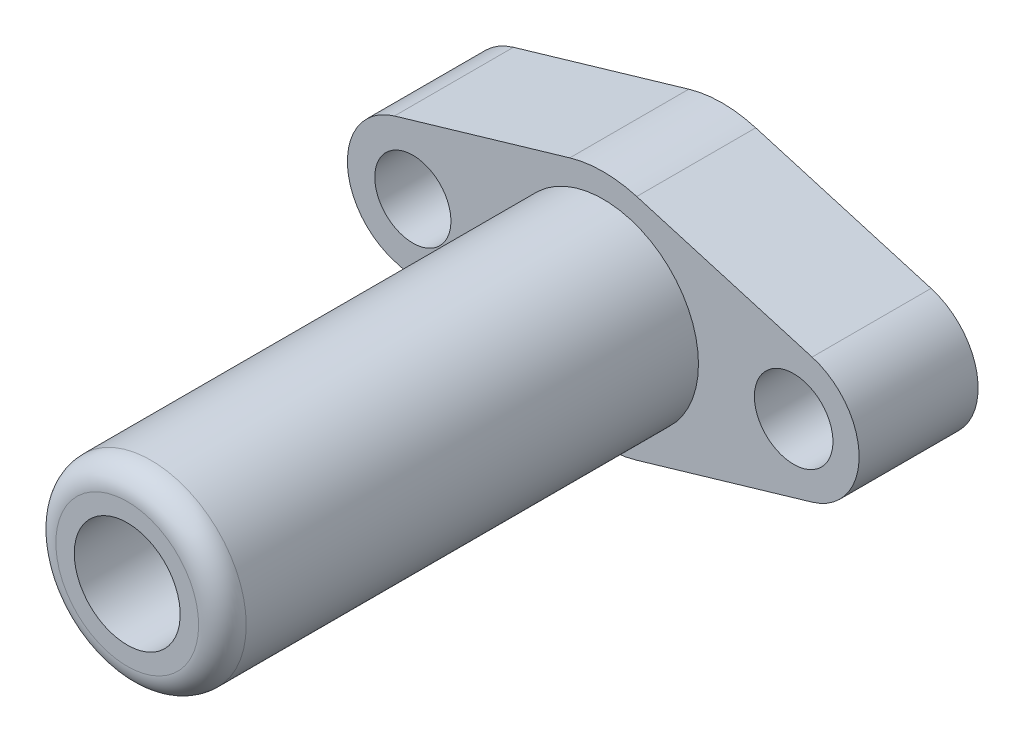
ISO-10303-21;
HEADER;
FILE_DESCRIPTION(('STEP AP214'),'2;1');
FILE_NAME('part.step','',(''),(''),'','','');
FILE_SCHEMA(('AUTOMOTIVE_DESIGN { 1 0 10303 214 1 1 1 1 }'));
ENDSEC;
DATA;
#1=APPLICATION_CONTEXT('core data for automotive mechanical design processes');
#2=APPLICATION_PROTOCOL_DEFINITION('international standard','automotive_design',2000,#1);
#3=PRODUCT_CONTEXT('',#1,'mechanical');
#4=PRODUCT('Part','Part','',(#3));
#5=PRODUCT_RELATED_PRODUCT_CATEGORY('part','',(#4));
#6=PRODUCT_DEFINITION_FORMATION('','',#4);
#7=PRODUCT_DEFINITION_CONTEXT('part definition',#1,'design');
#8=PRODUCT_DEFINITION('design','',#6,#7);
#9=PRODUCT_DEFINITION_SHAPE('','',#8);
#10=(LENGTH_UNIT() NAMED_UNIT(*) SI_UNIT(.MILLI.,.METRE.));
#11=(NAMED_UNIT(*) PLANE_ANGLE_UNIT() SI_UNIT($,.RADIAN.));
#12=(NAMED_UNIT(*) SI_UNIT($,.STERADIAN.) SOLID_ANGLE_UNIT());
#13=UNCERTAINTY_MEASURE_WITH_UNIT(LENGTH_MEASURE(1.E-05),#10,'distance_accuracy_value','');
#14=(GEOMETRIC_REPRESENTATION_CONTEXT(3) GLOBAL_UNCERTAINTY_ASSIGNED_CONTEXT((#13)) GLOBAL_UNIT_ASSIGNED_CONTEXT((#10,
#11,#12)) REPRESENTATION_CONTEXT('',''));
#15=CARTESIAN_POINT('',(0.,0.,0.));
#16=DIRECTION('',(0.,0.,1.));
#17=DIRECTION('',(1.,0.,0.));
#18=AXIS2_PLACEMENT_3D('',#15,#16,#17);
#19=CARTESIAN_POINT('',(0.,0.,20.));
#20=DIRECTION('',(0.,0.,-1.));
#21=DIRECTION('',(-1.,0.,0.));
#22=AXIS2_PLACEMENT_3D('',#19,#20,#21);
#23=CYLINDRICAL_SURFACE('',#22,4.);
#24=CARTESIAN_POINT('',(0.,0.,19.));
#25=DIRECTION('',(0.,0.,1.));
#26=DIRECTION('',(1.,0.,0.));
#27=AXIS2_PLACEMENT_3D('',#24,#25,#26);
#28=CIRCLE('',#27,4.);
#29=CARTESIAN_POINT('',(4.,0.,19.));
#30=VERTEX_POINT('',#29);
#31=EDGE_CURVE('E11',#30,#30,#28,.F.);
#32=ORIENTED_EDGE('',*,*,#31,.T.);
#33=EDGE_LOOP('',(#32));
#34=FACE_BOUND('',#33,.T.);
#35=CARTESIAN_POINT('',(0.,0.,0.));
#36=DIRECTION('',(0.,0.,1.));
#37=DIRECTION('',(1.,0.,0.));
#38=AXIS2_PLACEMENT_3D('',#35,#36,#37);
#39=CIRCLE('',#38,4.);
#40=CARTESIAN_POINT('',(4.,0.,0.));
#41=VERTEX_POINT('',#40);
#42=EDGE_CURVE('E194',#41,#41,#39,.T.);
#43=ORIENTED_EDGE('',*,*,#42,.T.);
#44=EDGE_LOOP('',(#43));
#45=FACE_BOUND('',#44,.T.);
#46=ADVANCED_FACE('F45',(#34,#45),#23,.T.);
#47=CARTESIAN_POINT('',(0.,0.,20.));
#48=DIRECTION('',(0.,0.,1.));
#49=DIRECTION('',(1.,0.,0.));
#50=AXIS2_PLACEMENT_3D('',#47,#48,#49);
#51=PLANE('',#50);
#52=CARTESIAN_POINT('',(0.,0.,20.));
#53=DIRECTION('',(0.,0.,1.));
#54=DIRECTION('',(1.,0.,0.));
#55=AXIS2_PLACEMENT_3D('',#52,#53,#54);
#56=CIRCLE('',#55,3.);
#57=CARTESIAN_POINT('',(3.,0.,20.));
#58=VERTEX_POINT('',#57);
#59=EDGE_CURVE('E55',#58,#58,#56,.T.);
#60=ORIENTED_EDGE('',*,*,#59,.T.);
#61=EDGE_LOOP('',(#60));
#62=FACE_BOUND('',#61,.T.);
#63=CARTESIAN_POINT('',(0.,0.,20.));
#64=DIRECTION('',(0.,0.,-1.));
#65=DIRECTION('',(-1.,0.,0.));
#66=AXIS2_PLACEMENT_3D('',#63,#64,#65);
#67=CIRCLE('',#66,2.225);
#68=CARTESIAN_POINT('',(-2.225,0.,20.));
#69=VERTEX_POINT('',#68);
#70=EDGE_CURVE('E288',#69,#69,#67,.T.);
#71=ORIENTED_EDGE('',*,*,#70,.T.);
#72=EDGE_LOOP('',(#71));
#73=FACE_BOUND('',#72,.T.);
#74=ADVANCED_FACE('F201',(#62,#73),#51,.T.);
#75=CARTESIAN_POINT('',(0.,0.,-5.));
#76=DIRECTION('',(0.,0.,-1.));
#77=DIRECTION('',(-1.,0.,0.));
#78=AXIS2_PLACEMENT_3D('',#75,#76,#77);
#79=PLANE('',#78);
#80=CARTESIAN_POINT('',(0.,0.,-5.));
#81=DIRECTION('',(0.,0.,-1.));
#82=DIRECTION('',(-1.,0.,0.));
#83=AXIS2_PLACEMENT_3D('',#80,#81,#82);
#84=CIRCLE('',#83,2.25);
#85=CARTESIAN_POINT('',(-2.25,0.,-5.));
#86=VERTEX_POINT('',#85);
#87=EDGE_CURVE('E280',#86,#86,#84,.T.);
#88=ORIENTED_EDGE('',*,*,#87,.F.);
#89=EDGE_LOOP('',(#88));
#90=FACE_BOUND('',#89,.T.);
#91=CARTESIAN_POINT('',(8.,0.,-5.));
#92=DIRECTION('',(0.,0.,-1.));
#93=DIRECTION('',(-1.,0.,0.));
#94=AXIS2_PLACEMENT_3D('',#91,#92,#93);
#95=CIRCLE('',#94,1.65);
#96=CARTESIAN_POINT('',(6.35,0.,-5.));
#97=VERTEX_POINT('',#96);
#98=EDGE_CURVE('E154',#97,#97,#95,.T.);
#99=ORIENTED_EDGE('',*,*,#98,.F.);
#100=EDGE_LOOP('',(#99));
#101=FACE_BOUND('',#100,.T.);
#102=CARTESIAN_POINT('',(0.,0.,-5.));
#103=DIRECTION('',(0.,0.,-1.));
#104=DIRECTION('',(-1.,0.,0.));
#105=AXIS2_PLACEMENT_3D('',#102,#103,#104);
#106=CIRCLE('',#105,5.);
#107=CARTESIAN_POINT('',(-1.40625,4.79817266649503,-5.));
#108=VERTEX_POINT('',#107);
#109=CARTESIAN_POINT('',(1.40625,4.79817266649503,-5.));
#110=VERTEX_POINT('',#109);
#111=EDGE_CURVE('E172',#108,#110,#106,.T.);
#112=ORIENTED_EDGE('',*,*,#111,.T.);
#113=DIRECTION('',(0.959634533299005,-0.28125,0.));
#114=VECTOR('',#113,1.);
#115=CARTESIAN_POINT('',(8.7734375,2.63899496657226,-5.));
#116=LINE('',#115,#114);
#117=CARTESIAN_POINT('',(8.7734375,2.63899496657226,-5.));
#118=VERTEX_POINT('',#117);
#119=EDGE_CURVE('E107',#110,#118,#116,.T.);
#120=ORIENTED_EDGE('',*,*,#119,.T.);
#121=CARTESIAN_POINT('',(8.,0.,-5.));
#122=DIRECTION('',(0.,0.,-1.));
#123=DIRECTION('',(-1.,0.,0.));
#124=AXIS2_PLACEMENT_3D('',#121,#122,#123);
#125=CIRCLE('',#124,2.75);
#126=CARTESIAN_POINT('',(8.7734375,-2.63899496657226,-5.));
#127=VERTEX_POINT('',#126);
#128=EDGE_CURVE('E307',#118,#127,#125,.T.);
#129=ORIENTED_EDGE('',*,*,#128,.T.);
#130=DIRECTION('',(-0.959634533299005,-0.28125,0.));
#131=VECTOR('',#130,1.);
#132=CARTESIAN_POINT('',(8.7734375,-2.63899496657226,-5.));
#133=LINE('',#132,#131);
#134=CARTESIAN_POINT('',(1.40625,-4.79817266649503,-5.));
#135=VERTEX_POINT('',#134);
#136=EDGE_CURVE('E310',#127,#135,#133,.T.);
#137=ORIENTED_EDGE('',*,*,#136,.T.);
#138=CARTESIAN_POINT('',(0.,0.,-5.));
#139=DIRECTION('',(0.,0.,-1.));
#140=DIRECTION('',(-1.,0.,0.));
#141=AXIS2_PLACEMENT_3D('',#138,#139,#140);
#142=CIRCLE('',#141,5.);
#143=CARTESIAN_POINT('',(-1.40625,-4.79817266649503,-5.));
#144=VERTEX_POINT('',#143);
#145=EDGE_CURVE('E127',#135,#144,#142,.T.);
#146=ORIENTED_EDGE('',*,*,#145,.T.);
#147=DIRECTION('',(-0.959634533299005,0.28125,0.));
#148=VECTOR('',#147,1.);
#149=CARTESIAN_POINT('',(-8.7734375,-2.63899496657226,-5.));
#150=LINE('',#149,#148);
#151=CARTESIAN_POINT('',(-8.7734375,-2.63899496657226,-5.));
#152=VERTEX_POINT('',#151);
#153=EDGE_CURVE('E120',#144,#152,#150,.T.);
#154=ORIENTED_EDGE('',*,*,#153,.T.);
#155=CARTESIAN_POINT('',(-8.,0.,-5.));
#156=DIRECTION('',(0.,0.,-1.));
#157=DIRECTION('',(-1.,0.,0.));
#158=AXIS2_PLACEMENT_3D('',#155,#156,#157);
#159=CIRCLE('',#158,2.75);
#160=CARTESIAN_POINT('',(-8.7734375,2.63899496657227,-5.));
#161=VERTEX_POINT('',#160);
#162=EDGE_CURVE('E125',#152,#161,#159,.T.);
#163=ORIENTED_EDGE('',*,*,#162,.T.);
#164=DIRECTION('',(0.959634533299005,0.28125,0.));
#165=VECTOR('',#164,1.);
#166=CARTESIAN_POINT('',(-8.7734375,2.63899496657226,-5.));
#167=LINE('',#166,#165);
#168=EDGE_CURVE('E63',#161,#108,#167,.T.);
#169=ORIENTED_EDGE('',*,*,#168,.T.);
#170=EDGE_LOOP('',(#112,#120,#129,#137,#146,#154,#163,#169));
#171=FACE_BOUND('',#170,.T.);
#172=CARTESIAN_POINT('',(-8.,0.,-5.));
#173=DIRECTION('',(0.,0.,-1.));
#174=DIRECTION('',(-1.,0.,0.));
#175=AXIS2_PLACEMENT_3D('',#172,#173,#174);
#176=CIRCLE('',#175,1.6);
#177=CARTESIAN_POINT('',(-9.6,0.,-5.));
#178=VERTEX_POINT('',#177);
#179=EDGE_CURVE('E285',#178,#178,#176,.T.);
#180=ORIENTED_EDGE('',*,*,#179,.F.);
#181=EDGE_LOOP('',(#180));
#182=FACE_BOUND('',#181,.T.);
#183=ADVANCED_FACE('F122',(#90,#101,#171,#182),#79,.T.);
#184=CARTESIAN_POINT('',(0.,0.,0.));
#185=DIRECTION('',(0.,0.,-1.));
#186=DIRECTION('',(-1.,0.,0.));
#187=AXIS2_PLACEMENT_3D('',#184,#185,#186);
#188=PLANE('',#187);
#189=ORIENTED_EDGE('',*,*,#42,.F.);
#190=EDGE_LOOP('',(#189));
#191=FACE_BOUND('',#190,.T.);
#192=CARTESIAN_POINT('',(0.,0.,0.));
#193=DIRECTION('',(0.,0.,-1.));
#194=DIRECTION('',(-1.,0.,0.));
#195=AXIS2_PLACEMENT_3D('',#192,#193,#194);
#196=CIRCLE('',#195,5.);
#197=CARTESIAN_POINT('',(-1.40625,4.79817266649503,0.));
#198=VERTEX_POINT('',#197);
#199=CARTESIAN_POINT('',(1.40625,4.79817266649503,0.));
#200=VERTEX_POINT('',#199);
#201=EDGE_CURVE('E149',#198,#200,#196,.T.);
#202=ORIENTED_EDGE('',*,*,#201,.F.);
#203=DIRECTION('',(0.959634533299005,0.28125,0.));
#204=VECTOR('',#203,1.);
#205=CARTESIAN_POINT('',(-8.7734375,2.63899496657226,0.));
#206=LINE('',#205,#204);
#207=CARTESIAN_POINT('',(-8.7734375,2.63899496657227,0.));
#208=VERTEX_POINT('',#207);
#209=EDGE_CURVE('E98',#208,#198,#206,.T.);
#210=ORIENTED_EDGE('',*,*,#209,.F.);
#211=CARTESIAN_POINT('',(-8.,0.,0.));
#212=DIRECTION('',(0.,0.,-1.));
#213=DIRECTION('',(-1.,0.,0.));
#214=AXIS2_PLACEMENT_3D('',#211,#212,#213);
#215=CIRCLE('',#214,2.75);
#216=CARTESIAN_POINT('',(-8.7734375,-2.63899496657226,0.));
#217=VERTEX_POINT('',#216);
#218=EDGE_CURVE('E92',#217,#208,#215,.T.);
#219=ORIENTED_EDGE('',*,*,#218,.F.);
#220=DIRECTION('',(-0.959634533299005,0.28125,0.));
#221=VECTOR('',#220,1.);
#222=CARTESIAN_POINT('',(-8.7734375,-2.63899496657226,0.));
#223=LINE('',#222,#221);
#224=CARTESIAN_POINT('',(-1.40625,-4.79817266649503,0.));
#225=VERTEX_POINT('',#224);
#226=EDGE_CURVE('E136',#225,#217,#223,.T.);
#227=ORIENTED_EDGE('',*,*,#226,.F.);
#228=CARTESIAN_POINT('',(0.,0.,0.));
#229=DIRECTION('',(0.,0.,-1.));
#230=DIRECTION('',(-1.,0.,0.));
#231=AXIS2_PLACEMENT_3D('',#228,#229,#230);
#232=CIRCLE('',#231,5.);
#233=CARTESIAN_POINT('',(1.40625,-4.79817266649503,0.));
#234=VERTEX_POINT('',#233);
#235=EDGE_CURVE('E163',#234,#225,#232,.T.);
#236=ORIENTED_EDGE('',*,*,#235,.F.);
#237=DIRECTION('',(-0.959634533299005,-0.28125,0.));
#238=VECTOR('',#237,1.);
#239=CARTESIAN_POINT('',(8.7734375,-2.63899496657226,0.));
#240=LINE('',#239,#238);
#241=CARTESIAN_POINT('',(8.7734375,-2.63899496657226,0.));
#242=VERTEX_POINT('',#241);
#243=EDGE_CURVE('E160',#242,#234,#240,.T.);
#244=ORIENTED_EDGE('',*,*,#243,.F.);
#245=CARTESIAN_POINT('',(8.,0.,0.));
#246=DIRECTION('',(0.,0.,-1.));
#247=DIRECTION('',(-1.,0.,0.));
#248=AXIS2_PLACEMENT_3D('',#245,#246,#247);
#249=CIRCLE('',#248,2.75);
#250=CARTESIAN_POINT('',(8.7734375,2.63899496657226,0.));
#251=VERTEX_POINT('',#250);
#252=EDGE_CURVE('E157',#251,#242,#249,.T.);
#253=ORIENTED_EDGE('',*,*,#252,.F.);
#254=DIRECTION('',(0.959634533299005,-0.28125,0.));
#255=VECTOR('',#254,1.);
#256=CARTESIAN_POINT('',(8.7734375,2.63899496657226,0.));
#257=LINE('',#256,#255);
#258=EDGE_CURVE('E153',#200,#251,#257,.T.);
#259=ORIENTED_EDGE('',*,*,#258,.F.);
#260=EDGE_LOOP('',(#202,#210,#219,#227,#236,#244,#253,#259));
#261=FACE_BOUND('',#260,.T.);
#262=CARTESIAN_POINT('',(8.,0.,0.));
#263=DIRECTION('',(0.,0.,-1.));
#264=DIRECTION('',(-1.,0.,0.));
#265=AXIS2_PLACEMENT_3D('',#262,#263,#264);
#266=CIRCLE('',#265,1.65);
#267=CARTESIAN_POINT('',(6.35,0.,0.));
#268=VERTEX_POINT('',#267);
#269=EDGE_CURVE('E295',#268,#268,#266,.T.);
#270=ORIENTED_EDGE('',*,*,#269,.T.);
#271=EDGE_LOOP('',(#270));
#272=FACE_BOUND('',#271,.T.);
#273=CARTESIAN_POINT('',(-8.,0.,0.));
#274=DIRECTION('',(0.,0.,-1.));
#275=DIRECTION('',(-1.,0.,0.));
#276=AXIS2_PLACEMENT_3D('',#273,#274,#275);
#277=CIRCLE('',#276,1.6);
#278=CARTESIAN_POINT('',(-9.6,0.,0.));
#279=VERTEX_POINT('',#278);
#280=EDGE_CURVE('E279',#279,#279,#277,.T.);
#281=ORIENTED_EDGE('',*,*,#280,.T.);
#282=EDGE_LOOP('',(#281));
#283=FACE_BOUND('',#282,.T.);
#284=ADVANCED_FACE('F226',(#191,#261,#272,#283),#188,.F.);
#285=CARTESIAN_POINT('',(0.,0.,-5.));
#286=DIRECTION('',(0.,0.,1.));
#287=DIRECTION('',(1.,0.,0.));
#288=AXIS2_PLACEMENT_3D('',#285,#286,#287);
#289=CYLINDRICAL_SURFACE('',#288,5.);
#290=ORIENTED_EDGE('',*,*,#201,.T.);
#291=DIRECTION('',(0.,0.,1.));
#292=VECTOR('',#291,1.);
#293=CARTESIAN_POINT('',(1.40625,4.79817266649503,-5.));
#294=LINE('',#293,#292);
#295=EDGE_CURVE('E191',#110,#200,#294,.T.);
#296=ORIENTED_EDGE('',*,*,#295,.F.);
#297=ORIENTED_EDGE('',*,*,#111,.F.);
#298=DIRECTION('',(0.,0.,1.));
#299=VECTOR('',#298,1.);
#300=CARTESIAN_POINT('',(-1.40625,4.79817266649503,-5.));
#301=LINE('',#300,#299);
#302=EDGE_CURVE('E145',#108,#198,#301,.T.);
#303=ORIENTED_EDGE('',*,*,#302,.T.);
#304=EDGE_LOOP('',(#290,#296,#297,#303));
#305=FACE_BOUND('',#304,.T.);
#306=ADVANCED_FACE('F222',(#305),#289,.T.);
#307=CARTESIAN_POINT('',(8.7734375,2.63899496657226,-5.));
#308=DIRECTION('',(-0.28125,-0.959634533299005,0.));
#309=DIRECTION('',(0.959634533299005,-0.28125,0.));
#310=AXIS2_PLACEMENT_3D('',#307,#308,#309);
#311=PLANE('',#310);
#312=ORIENTED_EDGE('',*,*,#258,.T.);
#313=DIRECTION('',(0.,0.,1.));
#314=VECTOR('',#313,1.);
#315=CARTESIAN_POINT('',(8.7734375,2.63899496657226,-5.));
#316=LINE('',#315,#314);
#317=EDGE_CURVE('E187',#118,#251,#316,.T.);
#318=ORIENTED_EDGE('',*,*,#317,.F.);
#319=ORIENTED_EDGE('',*,*,#119,.F.);
#320=ORIENTED_EDGE('',*,*,#295,.T.);
#321=EDGE_LOOP('',(#312,#318,#319,#320));
#322=FACE_BOUND('',#321,.T.);
#323=ADVANCED_FACE('F225',(#322),#311,.F.);
#324=CARTESIAN_POINT('',(8.,0.,-5.));
#325=DIRECTION('',(0.,0.,1.));
#326=DIRECTION('',(1.,0.,0.));
#327=AXIS2_PLACEMENT_3D('',#324,#325,#326);
#328=CYLINDRICAL_SURFACE('',#327,2.75);
#329=ORIENTED_EDGE('',*,*,#252,.T.);
#330=DIRECTION('',(0.,0.,1.));
#331=VECTOR('',#330,1.);
#332=CARTESIAN_POINT('',(8.7734375,-2.63899496657226,-5.));
#333=LINE('',#332,#331);
#334=EDGE_CURVE('E183',#127,#242,#333,.T.);
#335=ORIENTED_EDGE('',*,*,#334,.F.);
#336=ORIENTED_EDGE('',*,*,#128,.F.);
#337=ORIENTED_EDGE('',*,*,#317,.T.);
#338=EDGE_LOOP('',(#329,#335,#336,#337));
#339=FACE_BOUND('',#338,.T.);
#340=ADVANCED_FACE('F230',(#339),#328,.T.);
#341=CARTESIAN_POINT('',(8.7734375,-2.63899496657226,-5.));
#342=DIRECTION('',(-0.28125,0.959634533299005,0.));
#343=DIRECTION('',(-0.959634533299005,-0.28125,0.));
#344=AXIS2_PLACEMENT_3D('',#341,#342,#343);
#345=PLANE('',#344);
#346=ORIENTED_EDGE('',*,*,#243,.T.);
#347=DIRECTION('',(0.,0.,1.));
#348=VECTOR('',#347,1.);
#349=CARTESIAN_POINT('',(1.40625,-4.79817266649503,-5.));
#350=LINE('',#349,#348);
#351=EDGE_CURVE('E179',#135,#234,#350,.T.);
#352=ORIENTED_EDGE('',*,*,#351,.F.);
#353=ORIENTED_EDGE('',*,*,#136,.F.);
#354=ORIENTED_EDGE('',*,*,#334,.T.);
#355=EDGE_LOOP('',(#346,#352,#353,#354));
#356=FACE_BOUND('',#355,.T.);
#357=ADVANCED_FACE('F233',(#356),#345,.F.);
#358=CARTESIAN_POINT('',(0.,0.,-5.));
#359=DIRECTION('',(0.,0.,1.));
#360=DIRECTION('',(1.,0.,0.));
#361=AXIS2_PLACEMENT_3D('',#358,#359,#360);
#362=CYLINDRICAL_SURFACE('',#361,5.);
#363=ORIENTED_EDGE('',*,*,#235,.T.);
#364=DIRECTION('',(0.,0.,1.));
#365=VECTOR('',#364,1.);
#366=CARTESIAN_POINT('',(-1.40625,-4.79817266649503,-5.));
#367=LINE('',#366,#365);
#368=EDGE_CURVE('E138',#144,#225,#367,.T.);
#369=ORIENTED_EDGE('',*,*,#368,.F.);
#370=ORIENTED_EDGE('',*,*,#145,.F.);
#371=ORIENTED_EDGE('',*,*,#351,.T.);
#372=EDGE_LOOP('',(#363,#369,#370,#371));
#373=FACE_BOUND('',#372,.T.);
#374=ADVANCED_FACE('F237',(#373),#362,.T.);
#375=CARTESIAN_POINT('',(-8.7734375,-2.63899496657226,-5.));
#376=DIRECTION('',(0.28125,0.959634533299005,0.));
#377=DIRECTION('',(-0.959634533299005,0.28125,0.));
#378=AXIS2_PLACEMENT_3D('',#375,#376,#377);
#379=PLANE('',#378);
#380=ORIENTED_EDGE('',*,*,#226,.T.);
#381=DIRECTION('',(0.,0.,1.));
#382=VECTOR('',#381,1.);
#383=CARTESIAN_POINT('',(-8.7734375,-2.63899496657226,-5.));
#384=LINE('',#383,#382);
#385=EDGE_CURVE('E133',#152,#217,#384,.T.);
#386=ORIENTED_EDGE('',*,*,#385,.F.);
#387=ORIENTED_EDGE('',*,*,#153,.F.);
#388=ORIENTED_EDGE('',*,*,#368,.T.);
#389=EDGE_LOOP('',(#380,#386,#387,#388));
#390=FACE_BOUND('',#389,.T.);
#391=ADVANCED_FACE('F134',(#390),#379,.F.);
#392=CARTESIAN_POINT('',(-8.,0.,-5.));
#393=DIRECTION('',(0.,0.,1.));
#394=DIRECTION('',(1.,0.,0.));
#395=AXIS2_PLACEMENT_3D('',#392,#393,#394);
#396=CYLINDRICAL_SURFACE('',#395,2.75);
#397=ORIENTED_EDGE('',*,*,#218,.T.);
#398=DIRECTION('',(0.,0.,1.));
#399=VECTOR('',#398,1.);
#400=CARTESIAN_POINT('',(-8.7734375,2.63899496657227,-5.));
#401=LINE('',#400,#399);
#402=EDGE_CURVE('E139',#161,#208,#401,.T.);
#403=ORIENTED_EDGE('',*,*,#402,.F.);
#404=ORIENTED_EDGE('',*,*,#162,.F.);
#405=ORIENTED_EDGE('',*,*,#385,.T.);
#406=EDGE_LOOP('',(#397,#403,#404,#405));
#407=FACE_BOUND('',#406,.T.);
#408=ADVANCED_FACE('F141',(#407),#396,.T.);
#409=CARTESIAN_POINT('',(-8.7734375,2.63899496657226,-5.));
#410=DIRECTION('',(0.28125,-0.959634533299005,0.));
#411=DIRECTION('',(0.959634533299005,0.28125,0.));
#412=AXIS2_PLACEMENT_3D('',#409,#410,#411);
#413=PLANE('',#412);
#414=ORIENTED_EDGE('',*,*,#209,.T.);
#415=ORIENTED_EDGE('',*,*,#302,.F.);
#416=ORIENTED_EDGE('',*,*,#168,.F.);
#417=ORIENTED_EDGE('',*,*,#402,.T.);
#418=EDGE_LOOP('',(#414,#415,#416,#417));
#419=FACE_BOUND('',#418,.T.);
#420=ADVANCED_FACE('F246',(#419),#413,.F.);
#421=CARTESIAN_POINT('',(8.,0.,-5.));
#422=DIRECTION('',(0.,0.,1.));
#423=DIRECTION('',(1.,0.,0.));
#424=AXIS2_PLACEMENT_3D('',#421,#422,#423);
#425=CYLINDRICAL_SURFACE('',#424,1.65);
#426=ORIENTED_EDGE('',*,*,#98,.T.);
#427=EDGE_LOOP('',(#426));
#428=FACE_BOUND('',#427,.T.);
#429=ORIENTED_EDGE('',*,*,#269,.F.);
#430=EDGE_LOOP('',(#429));
#431=FACE_BOUND('',#430,.T.);
#432=ADVANCED_FACE('F249',(#428,#431),#425,.F.);
#433=CARTESIAN_POINT('',(-8.,0.,-5.));
#434=DIRECTION('',(0.,0.,1.));
#435=DIRECTION('',(1.,0.,0.));
#436=AXIS2_PLACEMENT_3D('',#433,#434,#435);
#437=CYLINDRICAL_SURFACE('',#436,1.6);
#438=ORIENTED_EDGE('',*,*,#179,.T.);
#439=EDGE_LOOP('',(#438));
#440=FACE_BOUND('',#439,.T.);
#441=ORIENTED_EDGE('',*,*,#280,.F.);
#442=EDGE_LOOP('',(#441));
#443=FACE_BOUND('',#442,.T.);
#444=ADVANCED_FACE('F258',(#440,#443),#437,.F.);
#445=CARTESIAN_POINT('',(0.,0.,7.));
#446=DIRECTION('',(0.,0.,-1.));
#447=DIRECTION('',(-1.,0.,0.));
#448=AXIS2_PLACEMENT_3D('',#445,#446,#447);
#449=CYLINDRICAL_SURFACE('',#448,2.25);
#450=CARTESIAN_POINT('',(0.,0.,7.));
#451=DIRECTION('',(0.,0.,-1.));
#452=DIRECTION('',(-1.,0.,0.));
#453=AXIS2_PLACEMENT_3D('',#450,#451,#452);
#454=CIRCLE('',#453,2.25);
#455=CARTESIAN_POINT('',(-2.25,0.,7.));
#456=VERTEX_POINT('',#455);
#457=EDGE_CURVE('E277',#456,#456,#454,.T.);
#458=ORIENTED_EDGE('',*,*,#457,.F.);
#459=EDGE_LOOP('',(#458));
#460=FACE_BOUND('',#459,.T.);
#461=ORIENTED_EDGE('',*,*,#87,.T.);
#462=EDGE_LOOP('',(#461));
#463=FACE_BOUND('',#462,.T.);
#464=ADVANCED_FACE('F262',(#460,#463),#449,.F.);
#465=CARTESIAN_POINT('',(0.,0.,7.));
#466=DIRECTION('',(0.,0.,-1.));
#467=DIRECTION('',(-1.,0.,0.));
#468=AXIS2_PLACEMENT_3D('',#465,#466,#467);
#469=PLANE('',#468);
#470=CARTESIAN_POINT('',(0.,0.,7.));
#471=DIRECTION('',(0.,0.,-1.));
#472=DIRECTION('',(-1.,0.,0.));
#473=AXIS2_PLACEMENT_3D('',#470,#471,#472);
#474=CIRCLE('',#473,2.225);
#475=CARTESIAN_POINT('',(-2.225,0.,7.));
#476=VERTEX_POINT('',#475);
#477=EDGE_CURVE('E274',#476,#476,#474,.T.);
#478=ORIENTED_EDGE('',*,*,#477,.F.);
#479=EDGE_LOOP('',(#478));
#480=FACE_BOUND('',#479,.T.);
#481=ORIENTED_EDGE('',*,*,#457,.T.);
#482=EDGE_LOOP('',(#481));
#483=FACE_BOUND('',#482,.T.);
#484=ADVANCED_FACE('F211',(#480,#483),#469,.T.);
#485=CARTESIAN_POINT('',(0.,0.,20.));
#486=DIRECTION('',(0.,0.,-1.));
#487=DIRECTION('',(-1.,0.,0.));
#488=AXIS2_PLACEMENT_3D('',#485,#486,#487);
#489=CYLINDRICAL_SURFACE('',#488,2.225);
#490=ORIENTED_EDGE('',*,*,#70,.F.);
#491=EDGE_LOOP('',(#490));
#492=FACE_BOUND('',#491,.T.);
#493=ORIENTED_EDGE('',*,*,#477,.T.);
#494=EDGE_LOOP('',(#493));
#495=FACE_BOUND('',#494,.T.);
#496=ADVANCED_FACE('F205',(#492,#495),#489,.F.);
#497=CARTESIAN_POINT('',(0.,0.,19.));
#498=DIRECTION('',(0.,0.,1.));
#499=DIRECTION('',(1.,0.,0.));
#500=AXIS2_PLACEMENT_3D('',#497,#498,#499);
#501=TOROIDAL_SURFACE('',#500,3.,1.);
#502=ORIENTED_EDGE('',*,*,#31,.F.);
#503=EDGE_LOOP('',(#502));
#504=FACE_BOUND('',#503,.T.);
#505=ORIENTED_EDGE('',*,*,#59,.F.);
#506=EDGE_LOOP('',(#505));
#507=FACE_BOUND('',#506,.T.);
#508=ADVANCED_FACE('F47',(#504,#507),#501,.T.);
#509=CLOSED_SHELL('',(#46,#74,#183,#284,#306,#323,#340,#357,#374,#391,#408,#420,#432,#444,#464,
#484,#496,#508));
#510=MANIFOLD_SOLID_BREP('B2',#509);
#511=ADVANCED_BREP_SHAPE_REPRESENTATION('',(#18,#510),#14);
#512=SHAPE_DEFINITION_REPRESENTATION(#9,#511);
ENDSEC;
END-ISO-10303-21;
